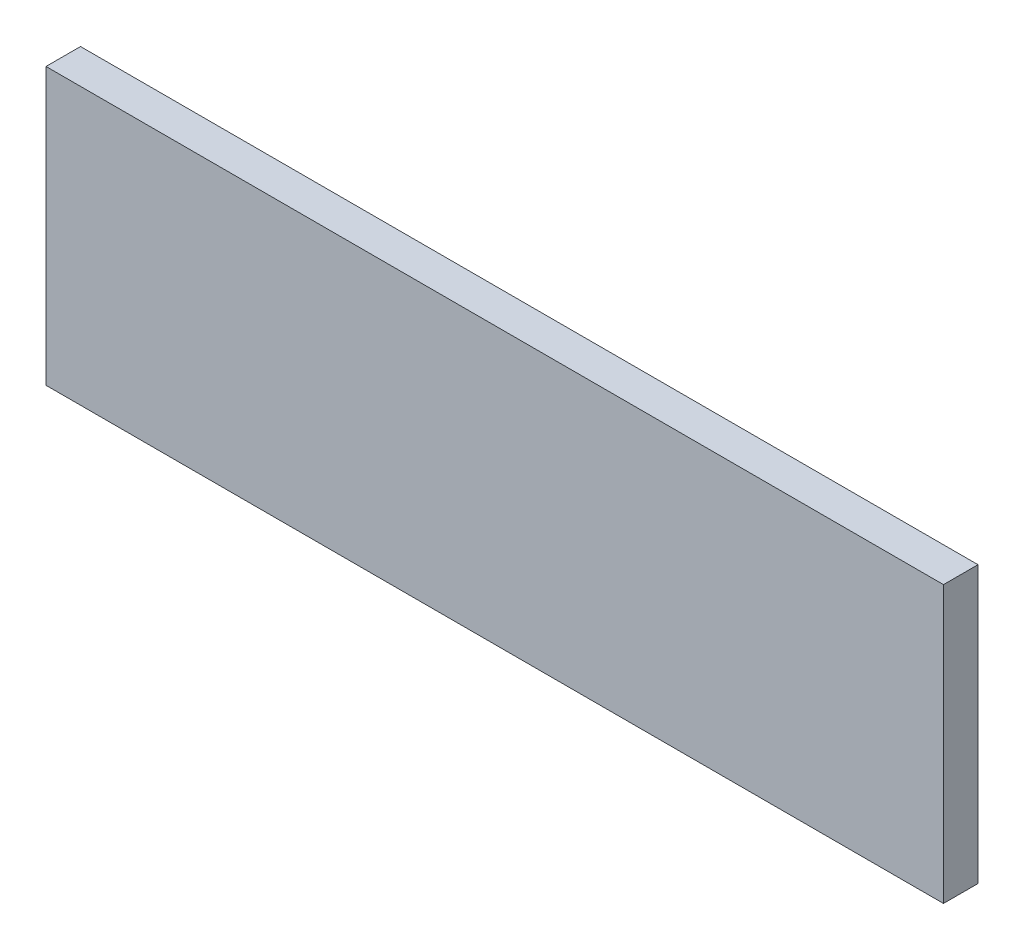
ISO-10303-21;
HEADER;
FILE_DESCRIPTION(('STEP AP214'),'2;1');
FILE_NAME('part.step','',(''),(''),'','','');
FILE_SCHEMA(('AUTOMOTIVE_DESIGN { 1 0 10303 214 1 1 1 1 }'));
ENDSEC;
DATA;
#1=APPLICATION_CONTEXT('core data for automotive mechanical design processes');
#2=APPLICATION_PROTOCOL_DEFINITION('international standard','automotive_design',2000,#1);
#3=PRODUCT_CONTEXT('',#1,'mechanical');
#4=PRODUCT('Part','Part','',(#3));
#5=PRODUCT_RELATED_PRODUCT_CATEGORY('part','',(#4));
#6=PRODUCT_DEFINITION_FORMATION('','',#4);
#7=PRODUCT_DEFINITION_CONTEXT('part definition',#1,'design');
#8=PRODUCT_DEFINITION('design','',#6,#7);
#9=PRODUCT_DEFINITION_SHAPE('','',#8);
#10=(LENGTH_UNIT() NAMED_UNIT(*) SI_UNIT(.MILLI.,.METRE.));
#11=(NAMED_UNIT(*) PLANE_ANGLE_UNIT() SI_UNIT($,.RADIAN.));
#12=(NAMED_UNIT(*) SI_UNIT($,.STERADIAN.) SOLID_ANGLE_UNIT());
#13=UNCERTAINTY_MEASURE_WITH_UNIT(LENGTH_MEASURE(1.E-05),#10,'distance_accuracy_value','');
#14=(GEOMETRIC_REPRESENTATION_CONTEXT(3) GLOBAL_UNCERTAINTY_ASSIGNED_CONTEXT((#13)) GLOBAL_UNIT_ASSIGNED_CONTEXT((#10,
#11,#12)) REPRESENTATION_CONTEXT('',''));
#15=CARTESIAN_POINT('',(0.,0.,0.));
#16=DIRECTION('',(0.,0.,1.));
#17=DIRECTION('',(1.,0.,0.));
#18=AXIS2_PLACEMENT_3D('',#15,#16,#17);
#19=CARTESIAN_POINT('',(0.,0.,0.2));
#20=DIRECTION('',(0.,0.,1.));
#21=DIRECTION('',(1.,0.,0.));
#22=AXIS2_PLACEMENT_3D('',#19,#20,#21);
#23=PLANE('',#22);
#24=DIRECTION('',(0.,1.,0.));
#25=VECTOR('',#24,1.);
#26=CARTESIAN_POINT('',(2.6,-0.8,0.2));
#27=LINE('',#26,#25);
#28=CARTESIAN_POINT('',(2.6,-0.8,0.2));
#29=VERTEX_POINT('',#28);
#30=CARTESIAN_POINT('',(2.6,0.8,0.2));
#31=VERTEX_POINT('',#30);
#32=EDGE_CURVE('E76',#29,#31,#27,.T.);
#33=ORIENTED_EDGE('',*,*,#32,.T.);
#34=DIRECTION('',(1.,0.,0.));
#35=VECTOR('',#34,1.);
#36=CARTESIAN_POINT('',(2.6,0.8,0.2));
#37=LINE('',#36,#35);
#38=CARTESIAN_POINT('',(-2.6,0.8,0.2));
#39=VERTEX_POINT('',#38);
#40=EDGE_CURVE('E58',#31,#39,#37,.F.);
#41=ORIENTED_EDGE('',*,*,#40,.T.);
#42=DIRECTION('',(0.,1.,0.));
#43=VECTOR('',#42,1.);
#44=CARTESIAN_POINT('',(-2.6,0.8,0.2));
#45=LINE('',#44,#43);
#46=CARTESIAN_POINT('',(-2.6,-0.8,0.2));
#47=VERTEX_POINT('',#46);
#48=EDGE_CURVE('E20',#39,#47,#45,.F.);
#49=ORIENTED_EDGE('',*,*,#48,.T.);
#50=DIRECTION('',(1.,0.,0.));
#51=VECTOR('',#50,1.);
#52=CARTESIAN_POINT('',(-2.6,-0.8,0.2));
#53=LINE('',#52,#51);
#54=EDGE_CURVE('E55',#47,#29,#53,.T.);
#55=ORIENTED_EDGE('',*,*,#54,.T.);
#56=EDGE_LOOP('',(#33,#41,#49,#55));
#57=FACE_BOUND('',#56,.T.);
#58=ADVANCED_FACE('F17',(#57),#23,.T.);
#59=CARTESIAN_POINT('',(-2.6,0.8,0.));
#60=DIRECTION('',(1.,0.,0.));
#61=DIRECTION('',(0.,0.,-1.));
#62=AXIS2_PLACEMENT_3D('',#59,#60,#61);
#63=PLANE('',#62);
#64=DIRECTION('',(0.,0.,1.));
#65=VECTOR('',#64,1.);
#66=CARTESIAN_POINT('',(-2.6,-0.8,0.));
#67=LINE('',#66,#65);
#68=CARTESIAN_POINT('',(-2.6,-0.8,0.));
#69=VERTEX_POINT('',#68);
#70=EDGE_CURVE('E63',#69,#47,#67,.T.);
#71=ORIENTED_EDGE('',*,*,#70,.T.);
#72=ORIENTED_EDGE('',*,*,#48,.F.);
#73=DIRECTION('',(0.,0.,-1.));
#74=VECTOR('',#73,1.);
#75=CARTESIAN_POINT('',(-2.6,0.8,0.));
#76=LINE('',#75,#74);
#77=CARTESIAN_POINT('',(-2.6,0.8,0.));
#78=VERTEX_POINT('',#77);
#79=EDGE_CURVE('E80',#39,#78,#76,.T.);
#80=ORIENTED_EDGE('',*,*,#79,.T.);
#81=DIRECTION('',(0.,1.,0.));
#82=VECTOR('',#81,1.);
#83=CARTESIAN_POINT('',(-2.6,0.,0.));
#84=LINE('',#83,#82);
#85=EDGE_CURVE('E73',#78,#69,#84,.F.);
#86=ORIENTED_EDGE('',*,*,#85,.T.);
#87=EDGE_LOOP('',(#71,#72,#80,#86));
#88=FACE_BOUND('',#87,.T.);
#89=ADVANCED_FACE('F72',(#88),#63,.F.);
#90=CARTESIAN_POINT('',(-2.6,-0.8,0.));
#91=DIRECTION('',(0.,1.,0.));
#92=DIRECTION('',(0.,0.,1.));
#93=AXIS2_PLACEMENT_3D('',#90,#91,#92);
#94=PLANE('',#93);
#95=DIRECTION('',(0.,0.,1.));
#96=VECTOR('',#95,1.);
#97=CARTESIAN_POINT('',(2.6,-0.8,0.));
#98=LINE('',#97,#96);
#99=CARTESIAN_POINT('',(2.6,-0.8,0.));
#100=VERTEX_POINT('',#99);
#101=EDGE_CURVE('E69',#100,#29,#98,.T.);
#102=ORIENTED_EDGE('',*,*,#101,.T.);
#103=ORIENTED_EDGE('',*,*,#54,.F.);
#104=ORIENTED_EDGE('',*,*,#70,.F.);
#105=DIRECTION('',(1.,0.,0.));
#106=VECTOR('',#105,1.);
#107=CARTESIAN_POINT('',(0.,-0.8,0.));
#108=LINE('',#107,#106);
#109=EDGE_CURVE('E83',#69,#100,#108,.T.);
#110=ORIENTED_EDGE('',*,*,#109,.T.);
#111=EDGE_LOOP('',(#102,#103,#104,#110));
#112=FACE_BOUND('',#111,.T.);
#113=ADVANCED_FACE('F66',(#112),#94,.F.);
#114=CARTESIAN_POINT('',(2.6,-0.8,0.));
#115=DIRECTION('',(-1.,0.,0.));
#116=DIRECTION('',(0.,0.,1.));
#117=AXIS2_PLACEMENT_3D('',#114,#115,#116);
#118=PLANE('',#117);
#119=DIRECTION('',(0.,0.,-1.));
#120=VECTOR('',#119,1.);
#121=CARTESIAN_POINT('',(2.6,0.8,0.));
#122=LINE('',#121,#120);
#123=CARTESIAN_POINT('',(2.6,0.8,0.));
#124=VERTEX_POINT('',#123);
#125=EDGE_CURVE('E34',#124,#31,#122,.F.);
#126=ORIENTED_EDGE('',*,*,#125,.T.);
#127=ORIENTED_EDGE('',*,*,#32,.F.);
#128=ORIENTED_EDGE('',*,*,#101,.F.);
#129=DIRECTION('',(0.,1.,0.));
#130=VECTOR('',#129,1.);
#131=CARTESIAN_POINT('',(2.6,0.,0.));
#132=LINE('',#131,#130);
#133=EDGE_CURVE('E26',#100,#124,#132,.T.);
#134=ORIENTED_EDGE('',*,*,#133,.T.);
#135=EDGE_LOOP('',(#126,#127,#128,#134));
#136=FACE_BOUND('',#135,.T.);
#137=ADVANCED_FACE('F88',(#136),#118,.F.);
#138=CARTESIAN_POINT('',(2.6,0.8,0.));
#139=DIRECTION('',(0.,-1.,0.));
#140=DIRECTION('',(0.,0.,-1.));
#141=AXIS2_PLACEMENT_3D('',#138,#139,#140);
#142=PLANE('',#141);
#143=ORIENTED_EDGE('',*,*,#79,.F.);
#144=ORIENTED_EDGE('',*,*,#40,.F.);
#145=ORIENTED_EDGE('',*,*,#125,.F.);
#146=DIRECTION('',(1.,0.,0.));
#147=VECTOR('',#146,1.);
#148=CARTESIAN_POINT('',(0.,0.8,0.));
#149=LINE('',#148,#147);
#150=EDGE_CURVE('E11',#124,#78,#149,.F.);
#151=ORIENTED_EDGE('',*,*,#150,.T.);
#152=EDGE_LOOP('',(#143,#144,#145,#151));
#153=FACE_BOUND('',#152,.T.);
#154=ADVANCED_FACE('F91',(#153),#142,.F.);
#155=CARTESIAN_POINT('',(0.,0.,0.));
#156=DIRECTION('',(0.,0.,1.));
#157=DIRECTION('',(1.,0.,0.));
#158=AXIS2_PLACEMENT_3D('',#155,#156,#157);
#159=PLANE('',#158);
#160=ORIENTED_EDGE('',*,*,#133,.F.);
#161=ORIENTED_EDGE('',*,*,#109,.F.);
#162=ORIENTED_EDGE('',*,*,#85,.F.);
#163=ORIENTED_EDGE('',*,*,#150,.F.);
#164=EDGE_LOOP('',(#160,#161,#162,#163));
#165=FACE_BOUND('',#164,.T.);
#166=ADVANCED_FACE('F90',(#165),#159,.F.);
#167=CLOSED_SHELL('',(#58,#89,#113,#137,#154,#166));
#168=MANIFOLD_SOLID_BREP('B1',#167);
#169=ADVANCED_BREP_SHAPE_REPRESENTATION('',(#18,#168),#14);
#170=SHAPE_DEFINITION_REPRESENTATION(#9,#169);
ENDSEC;
END-ISO-10303-21;
